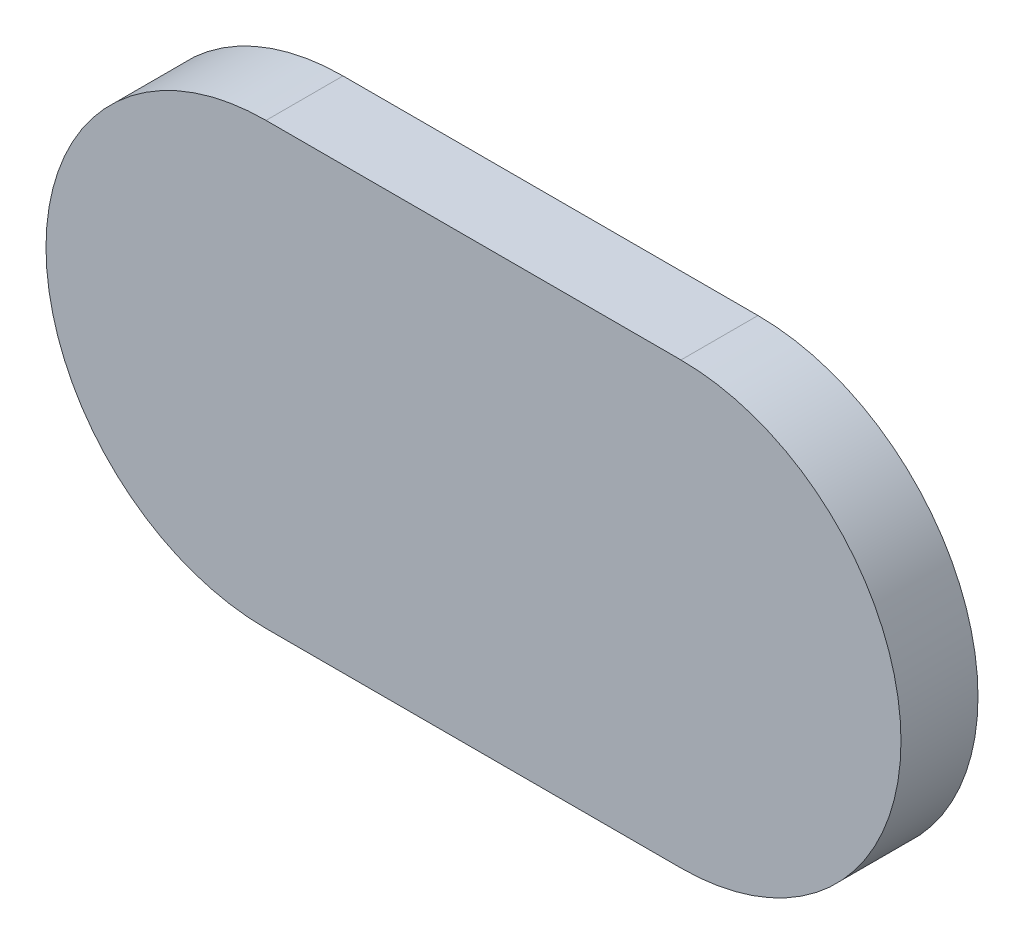
ISO-10303-21;
HEADER;
FILE_DESCRIPTION(('STEP AP214'),'2;1');
FILE_NAME('part.step','',(''),(''),'','','');
FILE_SCHEMA(('AUTOMOTIVE_DESIGN { 1 0 10303 214 1 1 1 1 }'));
ENDSEC;
DATA;
#1=APPLICATION_CONTEXT('core data for automotive mechanical design processes');
#2=APPLICATION_PROTOCOL_DEFINITION('international standard','automotive_design',2000,#1);
#3=PRODUCT_CONTEXT('',#1,'mechanical');
#4=PRODUCT('Part','Part','',(#3));
#5=PRODUCT_RELATED_PRODUCT_CATEGORY('part','',(#4));
#6=PRODUCT_DEFINITION_FORMATION('','',#4);
#7=PRODUCT_DEFINITION_CONTEXT('part definition',#1,'design');
#8=PRODUCT_DEFINITION('design','',#6,#7);
#9=PRODUCT_DEFINITION_SHAPE('','',#8);
#10=(LENGTH_UNIT() NAMED_UNIT(*) SI_UNIT(.MILLI.,.METRE.));
#11=(NAMED_UNIT(*) PLANE_ANGLE_UNIT() SI_UNIT($,.RADIAN.));
#12=(NAMED_UNIT(*) SI_UNIT($,.STERADIAN.) SOLID_ANGLE_UNIT());
#13=UNCERTAINTY_MEASURE_WITH_UNIT(LENGTH_MEASURE(1.E-05),#10,'distance_accuracy_value','');
#14=(GEOMETRIC_REPRESENTATION_CONTEXT(3) GLOBAL_UNCERTAINTY_ASSIGNED_CONTEXT((#13)) GLOBAL_UNIT_ASSIGNED_CONTEXT((#10,
#11,#12)) REPRESENTATION_CONTEXT('',''));
#15=CARTESIAN_POINT('',(0.,0.,0.));
#16=DIRECTION('',(0.,0.,1.));
#17=DIRECTION('',(1.,0.,0.));
#18=AXIS2_PLACEMENT_3D('',#15,#16,#17);
#19=CARTESIAN_POINT('',(89.497058,-123.525,1.635));
#20=DIRECTION('',(0.,0.,1.));
#21=DIRECTION('',(1.,0.,0.));
#22=AXIS2_PLACEMENT_3D('',#19,#20,#21);
#23=PLANE('',#22);
#24=DIRECTION('',(1.,0.,0.));
#25=VECTOR('',#24,1.);
#26=CARTESIAN_POINT('',(89.497058,-123.525,1.635));
#27=LINE('',#26,#25);
#28=CARTESIAN_POINT('',(89.497058,-123.525,1.635));
#29=VERTEX_POINT('',#28);
#30=CARTESIAN_POINT('',(89.68566,-123.525,1.635));
#31=VERTEX_POINT('',#30);
#32=EDGE_CURVE('E100',#29,#31,#27,.T.);
#33=ORIENTED_EDGE('',*,*,#32,.T.);
#34=CARTESIAN_POINT('',(89.68566,-123.425,1.635));
#35=DIRECTION('',(0.,0.,1.));
#36=DIRECTION('',(0.,-1.,0.));
#37=AXIS2_PLACEMENT_3D('',#34,#35,#36);
#38=CIRCLE('',#37,0.1);
#39=CARTESIAN_POINT('',(89.68566,-123.325,1.635));
#40=VERTEX_POINT('',#39);
#41=EDGE_CURVE('E80',#31,#40,#38,.T.);
#42=ORIENTED_EDGE('',*,*,#41,.T.);
#43=DIRECTION('',(-1.,0.,0.));
#44=VECTOR('',#43,1.);
#45=CARTESIAN_POINT('',(89.68566,-123.325,1.635));
#46=LINE('',#45,#44);
#47=CARTESIAN_POINT('',(89.497058,-123.325,1.635));
#48=VERTEX_POINT('',#47);
#49=EDGE_CURVE('E20',#40,#48,#46,.T.);
#50=ORIENTED_EDGE('',*,*,#49,.T.);
#51=CARTESIAN_POINT('',(89.497058,-123.425,1.635));
#52=DIRECTION('',(0.,0.,1.));
#53=DIRECTION('',(0.,1.,0.));
#54=AXIS2_PLACEMENT_3D('',#51,#52,#53);
#55=CIRCLE('',#54,0.1);
#56=EDGE_CURVE('E11',#48,#29,#55,.T.);
#57=ORIENTED_EDGE('',*,*,#56,.T.);
#58=EDGE_LOOP('',(#33,#42,#50,#57));
#59=FACE_BOUND('',#58,.T.);
#60=ADVANCED_FACE('F17',(#59),#23,.T.);
#61=CARTESIAN_POINT('',(89.497058,-123.525,1.6));
#62=DIRECTION('',(0.,0.,1.));
#63=DIRECTION('',(1.,0.,0.));
#64=AXIS2_PLACEMENT_3D('',#61,#62,#63);
#65=PLANE('',#64);
#66=CARTESIAN_POINT('',(89.497058,-123.425,1.6));
#67=DIRECTION('',(0.,0.,1.));
#68=DIRECTION('',(0.,1.,0.));
#69=AXIS2_PLACEMENT_3D('',#66,#67,#68);
#70=CIRCLE('',#69,0.1);
#71=CARTESIAN_POINT('',(89.497058,-123.325,1.6));
#72=VERTEX_POINT('',#71);
#73=CARTESIAN_POINT('',(89.497058,-123.525,1.6));
#74=VERTEX_POINT('',#73);
#75=EDGE_CURVE('E27',#72,#74,#70,.T.);
#76=ORIENTED_EDGE('',*,*,#75,.F.);
#77=DIRECTION('',(-1.,0.,0.));
#78=VECTOR('',#77,1.);
#79=CARTESIAN_POINT('',(89.68566,-123.325,1.6));
#80=LINE('',#79,#78);
#81=CARTESIAN_POINT('',(89.68566,-123.325,1.6));
#82=VERTEX_POINT('',#81);
#83=EDGE_CURVE('E68',#82,#72,#80,.T.);
#84=ORIENTED_EDGE('',*,*,#83,.F.);
#85=CARTESIAN_POINT('',(89.68566,-123.425,1.6));
#86=DIRECTION('',(0.,0.,1.));
#87=DIRECTION('',(0.,-1.,0.));
#88=AXIS2_PLACEMENT_3D('',#85,#86,#87);
#89=CIRCLE('',#88,0.1);
#90=CARTESIAN_POINT('',(89.68566,-123.525,1.6));
#91=VERTEX_POINT('',#90);
#92=EDGE_CURVE('E73',#91,#82,#89,.T.);
#93=ORIENTED_EDGE('',*,*,#92,.F.);
#94=DIRECTION('',(1.,0.,0.));
#95=VECTOR('',#94,1.);
#96=CARTESIAN_POINT('',(89.497058,-123.525,1.6));
#97=LINE('',#96,#95);
#98=EDGE_CURVE('E123',#74,#91,#97,.T.);
#99=ORIENTED_EDGE('',*,*,#98,.F.);
#100=EDGE_LOOP('',(#76,#84,#93,#99));
#101=FACE_BOUND('',#100,.T.);
#102=ADVANCED_FACE('F70',(#101),#65,.F.);
#103=CARTESIAN_POINT('',(89.497058,-123.425,1.6));
#104=DIRECTION('',(0.,0.,-1.));
#105=DIRECTION('',(0.,1.,0.));
#106=AXIS2_PLACEMENT_3D('',#103,#104,#105);
#107=CYLINDRICAL_SURFACE('',#106,0.1);
#108=ORIENTED_EDGE('',*,*,#75,.T.);
#109=DIRECTION('',(0.,0.,1.));
#110=VECTOR('',#109,1.);
#111=CARTESIAN_POINT('',(89.497058,-123.525,1.6));
#112=LINE('',#111,#110);
#113=EDGE_CURVE('E94',#74,#29,#112,.T.);
#114=ORIENTED_EDGE('',*,*,#113,.T.);
#115=ORIENTED_EDGE('',*,*,#56,.F.);
#116=DIRECTION('',(0.,0.,1.));
#117=VECTOR('',#116,1.);
#118=CARTESIAN_POINT('',(89.497058,-123.325,1.6));
#119=LINE('',#118,#117);
#120=EDGE_CURVE('E79',#72,#48,#119,.T.);
#121=ORIENTED_EDGE('',*,*,#120,.F.);
#122=EDGE_LOOP('',(#108,#114,#115,#121));
#123=FACE_BOUND('',#122,.T.);
#124=ADVANCED_FACE('F134',(#123),#107,.T.);
#125=CARTESIAN_POINT('',(89.68566,-123.325,1.6));
#126=DIRECTION('',(0.,-1.,0.));
#127=DIRECTION('',(0.,0.,-1.));
#128=AXIS2_PLACEMENT_3D('',#125,#126,#127);
#129=PLANE('',#128);
#130=ORIENTED_EDGE('',*,*,#83,.T.);
#131=ORIENTED_EDGE('',*,*,#120,.T.);
#132=ORIENTED_EDGE('',*,*,#49,.F.);
#133=DIRECTION('',(0.,0.,1.));
#134=VECTOR('',#133,1.);
#135=CARTESIAN_POINT('',(89.68566,-123.325,1.6));
#136=LINE('',#135,#134);
#137=EDGE_CURVE('E83',#82,#40,#136,.T.);
#138=ORIENTED_EDGE('',*,*,#137,.F.);
#139=EDGE_LOOP('',(#130,#131,#132,#138));
#140=FACE_BOUND('',#139,.T.);
#141=ADVANCED_FACE('F84',(#140),#129,.F.);
#142=CARTESIAN_POINT('',(89.68566,-123.425,1.6));
#143=DIRECTION('',(0.,0.,-1.));
#144=DIRECTION('',(0.,-1.,0.));
#145=AXIS2_PLACEMENT_3D('',#142,#143,#144);
#146=CYLINDRICAL_SURFACE('',#145,0.1);
#147=ORIENTED_EDGE('',*,*,#92,.T.);
#148=ORIENTED_EDGE('',*,*,#137,.T.);
#149=ORIENTED_EDGE('',*,*,#41,.F.);
#150=DIRECTION('',(0.,0.,1.));
#151=VECTOR('',#150,1.);
#152=CARTESIAN_POINT('',(89.68566,-123.525,1.6));
#153=LINE('',#152,#151);
#154=EDGE_CURVE('E91',#91,#31,#153,.T.);
#155=ORIENTED_EDGE('',*,*,#154,.F.);
#156=EDGE_LOOP('',(#147,#148,#149,#155));
#157=FACE_BOUND('',#156,.T.);
#158=ADVANCED_FACE('F89',(#157),#146,.T.);
#159=CARTESIAN_POINT('',(89.497058,-123.525,1.6));
#160=DIRECTION('',(0.,1.,0.));
#161=DIRECTION('',(1.,0.,0.));
#162=AXIS2_PLACEMENT_3D('',#159,#160,#161);
#163=PLANE('',#162);
#164=ORIENTED_EDGE('',*,*,#98,.T.);
#165=ORIENTED_EDGE('',*,*,#154,.T.);
#166=ORIENTED_EDGE('',*,*,#32,.F.);
#167=ORIENTED_EDGE('',*,*,#113,.F.);
#168=EDGE_LOOP('',(#164,#165,#166,#167));
#169=FACE_BOUND('',#168,.T.);
#170=ADVANCED_FACE('F130',(#169),#163,.F.);
#171=CLOSED_SHELL('',(#60,#102,#124,#141,#158,#170));
#172=MANIFOLD_SOLID_BREP('B1',#171);
#173=ADVANCED_BREP_SHAPE_REPRESENTATION('',(#18,#172),#14);
#174=SHAPE_DEFINITION_REPRESENTATION(#9,#173);
ENDSEC;
END-ISO-10303-21;
